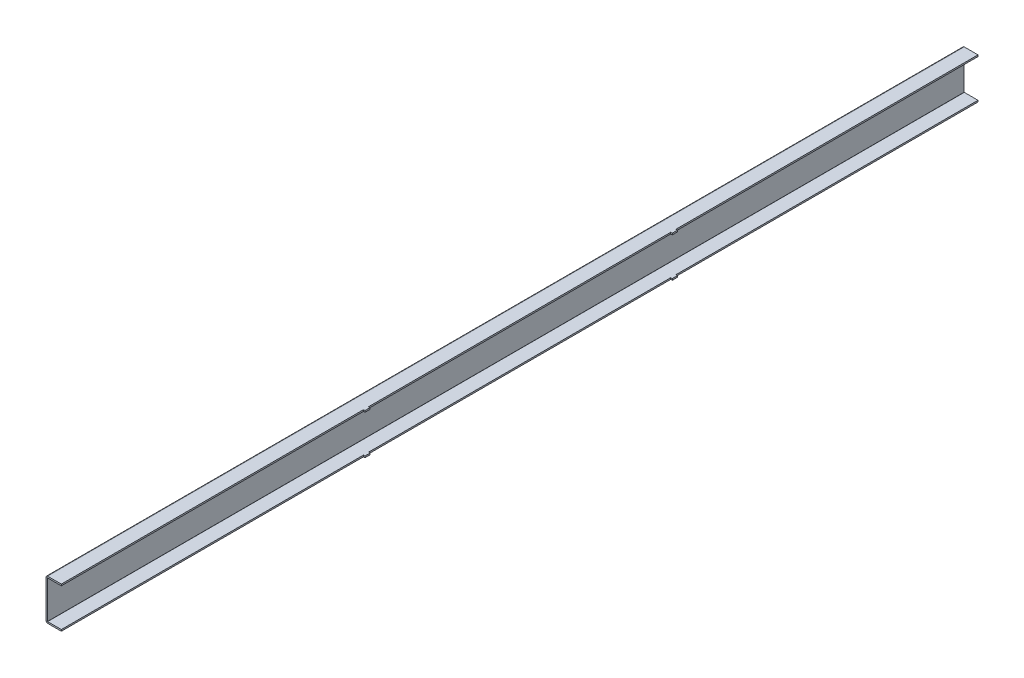
ISO-10303-21;
HEADER;
FILE_DESCRIPTION(('STEP AP214'),'2;1');
FILE_NAME('part.step','',(''),(''),'','','');
FILE_SCHEMA(('AUTOMOTIVE_DESIGN { 1 0 10303 214 1 1 1 1 }'));
ENDSEC;
DATA;
#1=APPLICATION_CONTEXT('core data for automotive mechanical design processes');
#2=APPLICATION_PROTOCOL_DEFINITION('international standard','automotive_design',2000,#1);
#3=PRODUCT_CONTEXT('',#1,'mechanical');
#4=PRODUCT('Part','Part','',(#3));
#5=PRODUCT_RELATED_PRODUCT_CATEGORY('part','',(#4));
#6=PRODUCT_DEFINITION_FORMATION('','',#4);
#7=PRODUCT_DEFINITION_CONTEXT('part definition',#1,'design');
#8=PRODUCT_DEFINITION('design','',#6,#7);
#9=PRODUCT_DEFINITION_SHAPE('','',#8);
#10=(LENGTH_UNIT() NAMED_UNIT(*) SI_UNIT(.MILLI.,.METRE.));
#11=(NAMED_UNIT(*) PLANE_ANGLE_UNIT() SI_UNIT($,.RADIAN.));
#12=(NAMED_UNIT(*) SI_UNIT($,.STERADIAN.) SOLID_ANGLE_UNIT());
#13=UNCERTAINTY_MEASURE_WITH_UNIT(LENGTH_MEASURE(1.E-05),#10,'distance_accuracy_value','');
#14=(GEOMETRIC_REPRESENTATION_CONTEXT(3) GLOBAL_UNCERTAINTY_ASSIGNED_CONTEXT((#13)) GLOBAL_UNIT_ASSIGNED_CONTEXT((#10,
#11,#12)) REPRESENTATION_CONTEXT('',''));
#15=CARTESIAN_POINT('',(0.,0.,0.));
#16=DIRECTION('',(0.,0.,1.));
#17=DIRECTION('',(1.,0.,0.));
#18=AXIS2_PLACEMENT_3D('',#15,#16,#17);
#19=CARTESIAN_POINT('',(197.5,1764.24748571651,602.833333333334));
#20=DIRECTION('',(0.,0.,1.));
#21=DIRECTION('',(0.,1.,0.));
#22=AXIS2_PLACEMENT_3D('',#19,#20,#21);
#23=PLANE('',#22);
#24=DIRECTION('',(-1.,0.,0.));
#25=VECTOR('',#24,1.);
#26=CARTESIAN_POINT('',(197.5,-30.,602.833333333334));
#27=LINE('',#26,#25);
#28=CARTESIAN_POINT('',(199.,-30.,602.833333333334));
#29=VERTEX_POINT('',#28);
#30=CARTESIAN_POINT('',(197.5,-30.,602.833333333334));
#31=VERTEX_POINT('',#30);
#32=EDGE_CURVE('E157',#29,#31,#27,.T.);
#33=ORIENTED_EDGE('',*,*,#32,.F.);
#34=DIRECTION('',(0.,-1.,0.));
#35=VECTOR('',#34,1.);
#36=CARTESIAN_POINT('',(199.,1764.24748571651,602.833333333334));
#37=LINE('',#36,#35);
#38=CARTESIAN_POINT('',(199.,-28.5,602.833333333334));
#39=VERTEX_POINT('',#38);
#40=EDGE_CURVE('E700',#39,#29,#37,.T.);
#41=ORIENTED_EDGE('',*,*,#40,.F.);
#42=DIRECTION('',(-1.,0.,0.));
#43=VECTOR('',#42,1.);
#44=CARTESIAN_POINT('',(197.5,-28.5,602.833333333334));
#45=LINE('',#44,#43);
#46=CARTESIAN_POINT('',(197.5,-28.5,602.833333333334));
#47=VERTEX_POINT('',#46);
#48=EDGE_CURVE('E151',#39,#47,#45,.T.);
#49=ORIENTED_EDGE('',*,*,#48,.T.);
#50=DIRECTION('',(0.,-1.,0.));
#51=VECTOR('',#50,1.);
#52=CARTESIAN_POINT('',(197.5,1764.24748571651,602.833333333334));
#53=LINE('',#52,#51);
#54=EDGE_CURVE('E706',#47,#31,#53,.T.);
#55=ORIENTED_EDGE('',*,*,#54,.T.);
#56=EDGE_LOOP('',(#33,#41,#49,#55));
#57=FACE_BOUND('',#56,.T.);
#58=ADVANCED_FACE('F55',(#57),#23,.T.);
#59=CARTESIAN_POINT('',(199.,1764.24748571651,597.833333333334));
#60=DIRECTION('',(1.,0.,0.));
#61=DIRECTION('',(0.,1.,0.));
#62=AXIS2_PLACEMENT_3D('',#59,#60,#61);
#63=PLANE('',#62);
#64=DIRECTION('',(0.,0.,1.));
#65=VECTOR('',#64,1.);
#66=CARTESIAN_POINT('',(199.,-30.,597.833333333334));
#67=LINE('',#66,#65);
#68=CARTESIAN_POINT('',(199.,-30.,597.833333333334));
#69=VERTEX_POINT('',#68);
#70=EDGE_CURVE('E397',#69,#29,#67,.T.);
#71=ORIENTED_EDGE('',*,*,#70,.F.);
#72=DIRECTION('',(0.,-1.,0.));
#73=VECTOR('',#72,1.);
#74=CARTESIAN_POINT('',(199.,1764.24748571651,597.833333333334));
#75=LINE('',#74,#73);
#76=CARTESIAN_POINT('',(199.,-28.5,597.833333333334));
#77=VERTEX_POINT('',#76);
#78=EDGE_CURVE('E692',#77,#69,#75,.T.);
#79=ORIENTED_EDGE('',*,*,#78,.F.);
#80=DIRECTION('',(0.,0.,1.));
#81=VECTOR('',#80,1.);
#82=CARTESIAN_POINT('',(199.,-28.5,597.833333333334));
#83=LINE('',#82,#81);
#84=EDGE_CURVE('E702',#77,#39,#83,.T.);
#85=ORIENTED_EDGE('',*,*,#84,.T.);
#86=ORIENTED_EDGE('',*,*,#40,.T.);
#87=EDGE_LOOP('',(#71,#79,#85,#86));
#88=FACE_BOUND('',#87,.T.);
#89=ADVANCED_FACE('F817',(#88),#63,.T.);
#90=CARTESIAN_POINT('',(197.5,1764.24748571651,597.833333333334));
#91=DIRECTION('',(0.,0.,-1.));
#92=DIRECTION('',(0.,-1.,0.));
#93=AXIS2_PLACEMENT_3D('',#90,#91,#92);
#94=PLANE('',#93);
#95=DIRECTION('',(1.,0.,0.));
#96=VECTOR('',#95,1.);
#97=CARTESIAN_POINT('',(197.5,-30.,597.833333333334));
#98=LINE('',#97,#96);
#99=CARTESIAN_POINT('',(197.5,-30.,597.833333333333));
#100=VERTEX_POINT('',#99);
#101=EDGE_CURVE('E389',#100,#69,#98,.T.);
#102=ORIENTED_EDGE('',*,*,#101,.F.);
#103=DIRECTION('',(0.,-1.,0.));
#104=VECTOR('',#103,1.);
#105=CARTESIAN_POINT('',(197.5,1764.24748571651,597.833333333333));
#106=LINE('',#105,#104);
#107=CARTESIAN_POINT('',(197.5,-28.5,597.833333333333));
#108=VERTEX_POINT('',#107);
#109=EDGE_CURVE('E652',#108,#100,#106,.T.);
#110=ORIENTED_EDGE('',*,*,#109,.F.);
#111=DIRECTION('',(1.,0.,0.));
#112=VECTOR('',#111,1.);
#113=CARTESIAN_POINT('',(197.5,-28.5,597.833333333334));
#114=LINE('',#113,#112);
#115=EDGE_CURVE('E696',#108,#77,#114,.T.);
#116=ORIENTED_EDGE('',*,*,#115,.T.);
#117=ORIENTED_EDGE('',*,*,#78,.T.);
#118=EDGE_LOOP('',(#102,#110,#116,#117));
#119=FACE_BOUND('',#118,.T.);
#120=ADVANCED_FACE('F822',(#119),#94,.T.);
#121=CARTESIAN_POINT('',(197.5,1764.24748571651,941.220018726588));
#122=DIRECTION('',(1.,0.,0.));
#123=DIRECTION('',(0.,1.,0.));
#124=AXIS2_PLACEMENT_3D('',#121,#122,#123);
#125=PLANE('',#124);
#126=DIRECTION('',(0.,0.,1.));
#127=VECTOR('',#126,1.);
#128=CARTESIAN_POINT('',(197.5,-30.,900.));
#129=LINE('',#128,#127);
#130=CARTESIAN_POINT('',(197.5,-30.,302.166666666667));
#131=VERTEX_POINT('',#130);
#132=EDGE_CURVE('E653',#100,#131,#129,.F.);
#133=ORIENTED_EDGE('',*,*,#132,.T.);
#134=DIRECTION('',(0.,-1.,0.));
#135=VECTOR('',#134,1.);
#136=CARTESIAN_POINT('',(197.5,1764.24748571651,302.166666666667));
#137=LINE('',#136,#135);
#138=CARTESIAN_POINT('',(197.5,-28.5,302.166666666667));
#139=VERTEX_POINT('',#138);
#140=EDGE_CURVE('E681',#139,#131,#137,.T.);
#141=ORIENTED_EDGE('',*,*,#140,.F.);
#142=DIRECTION('',(0.,0.,-1.));
#143=VECTOR('',#142,1.);
#144=CARTESIAN_POINT('',(197.5,-28.5,941.220018726588));
#145=LINE('',#144,#143);
#146=EDGE_CURVE('E642',#139,#108,#145,.F.);
#147=ORIENTED_EDGE('',*,*,#146,.T.);
#148=ORIENTED_EDGE('',*,*,#109,.T.);
#149=EDGE_LOOP('',(#133,#141,#147,#148));
#150=FACE_BOUND('',#149,.T.);
#151=ADVANCED_FACE('F831',(#150),#125,.T.);
#152=CARTESIAN_POINT('',(197.5,1764.24748571651,302.166666666667));
#153=DIRECTION('',(0.,0.,1.));
#154=DIRECTION('',(0.,1.,0.));
#155=AXIS2_PLACEMENT_3D('',#152,#153,#154);
#156=PLANE('',#155);
#157=DIRECTION('',(-1.,0.,0.));
#158=VECTOR('',#157,1.);
#159=CARTESIAN_POINT('',(197.5,-30.,302.166666666667));
#160=LINE('',#159,#158);
#161=CARTESIAN_POINT('',(199.,-30.,302.166666666667));
#162=VERTEX_POINT('',#161);
#163=EDGE_CURVE('E384',#162,#131,#160,.T.);
#164=ORIENTED_EDGE('',*,*,#163,.F.);
#165=DIRECTION('',(0.,-1.,0.));
#166=VECTOR('',#165,1.);
#167=CARTESIAN_POINT('',(199.,1764.24748571651,302.166666666667));
#168=LINE('',#167,#166);
#169=CARTESIAN_POINT('',(199.,-28.5,302.166666666667));
#170=VERTEX_POINT('',#169);
#171=EDGE_CURVE('E671',#170,#162,#168,.T.);
#172=ORIENTED_EDGE('',*,*,#171,.F.);
#173=DIRECTION('',(-1.,0.,0.));
#174=VECTOR('',#173,1.);
#175=CARTESIAN_POINT('',(197.5,-28.5,302.166666666667));
#176=LINE('',#175,#174);
#177=EDGE_CURVE('E684',#170,#139,#176,.T.);
#178=ORIENTED_EDGE('',*,*,#177,.T.);
#179=ORIENTED_EDGE('',*,*,#140,.T.);
#180=EDGE_LOOP('',(#164,#172,#178,#179));
#181=FACE_BOUND('',#180,.T.);
#182=ADVANCED_FACE('F838',(#181),#156,.T.);
#183=CARTESIAN_POINT('',(199.,1764.24748571651,297.166666666667));
#184=DIRECTION('',(1.,0.,0.));
#185=DIRECTION('',(0.,1.,0.));
#186=AXIS2_PLACEMENT_3D('',#183,#184,#185);
#187=PLANE('',#186);
#188=DIRECTION('',(0.,0.,1.));
#189=VECTOR('',#188,1.);
#190=CARTESIAN_POINT('',(199.,-30.,297.166666666667));
#191=LINE('',#190,#189);
#192=CARTESIAN_POINT('',(199.,-30.,297.166666666667));
#193=VERTEX_POINT('',#192);
#194=EDGE_CURVE('E379',#193,#162,#191,.T.);
#195=ORIENTED_EDGE('',*,*,#194,.F.);
#196=DIRECTION('',(0.,-1.,0.));
#197=VECTOR('',#196,1.);
#198=CARTESIAN_POINT('',(199.,1764.24748571651,297.166666666667));
#199=LINE('',#198,#197);
#200=CARTESIAN_POINT('',(199.,-28.5,297.166666666667));
#201=VERTEX_POINT('',#200);
#202=EDGE_CURVE('E647',#201,#193,#199,.T.);
#203=ORIENTED_EDGE('',*,*,#202,.F.);
#204=DIRECTION('',(0.,0.,1.));
#205=VECTOR('',#204,1.);
#206=CARTESIAN_POINT('',(199.,-28.5,297.166666666667));
#207=LINE('',#206,#205);
#208=EDGE_CURVE('E677',#201,#170,#207,.T.);
#209=ORIENTED_EDGE('',*,*,#208,.T.);
#210=ORIENTED_EDGE('',*,*,#171,.T.);
#211=EDGE_LOOP('',(#195,#203,#209,#210));
#212=FACE_BOUND('',#211,.T.);
#213=ADVANCED_FACE('F841',(#212),#187,.T.);
#214=CARTESIAN_POINT('',(197.5,1764.24748571651,297.166666666667));
#215=DIRECTION('',(0.,0.,-1.));
#216=DIRECTION('',(0.,-1.,0.));
#217=AXIS2_PLACEMENT_3D('',#214,#215,#216);
#218=PLANE('',#217);
#219=DIRECTION('',(1.,0.,0.));
#220=VECTOR('',#219,1.);
#221=CARTESIAN_POINT('',(197.5,-30.,297.166666666667));
#222=LINE('',#221,#220);
#223=CARTESIAN_POINT('',(197.5,-30.,297.166666666667));
#224=VERTEX_POINT('',#223);
#225=EDGE_CURVE('E329',#224,#193,#222,.T.);
#226=ORIENTED_EDGE('',*,*,#225,.F.);
#227=DIRECTION('',(0.,-1.,0.));
#228=VECTOR('',#227,1.);
#229=CARTESIAN_POINT('',(197.5,1764.24748571651,297.166666666667));
#230=LINE('',#229,#228);
#231=CARTESIAN_POINT('',(197.5,-28.5,297.166666666667));
#232=VERTEX_POINT('',#231);
#233=EDGE_CURVE('E639',#232,#224,#230,.T.);
#234=ORIENTED_EDGE('',*,*,#233,.F.);
#235=DIRECTION('',(1.,0.,0.));
#236=VECTOR('',#235,1.);
#237=CARTESIAN_POINT('',(197.5,-28.5,297.166666666667));
#238=LINE('',#237,#236);
#239=EDGE_CURVE('E634',#232,#201,#238,.T.);
#240=ORIENTED_EDGE('',*,*,#239,.T.);
#241=ORIENTED_EDGE('',*,*,#202,.T.);
#242=EDGE_LOOP('',(#226,#234,#240,#241));
#243=FACE_BOUND('',#242,.T.);
#244=ADVANCED_FACE('F837',(#243),#218,.T.);
#245=CARTESIAN_POINT('',(197.5,-30.,1.49999999999995));
#246=VERTEX_POINT('',#245);
#247=EDGE_CURVE('E640',#224,#246,#129,.F.);
#248=ORIENTED_EDGE('',*,*,#247,.T.);
#249=DIRECTION('',(0.,-1.,0.));
#250=VECTOR('',#249,1.);
#251=CARTESIAN_POINT('',(197.5,1764.24748571651,1.49999999999996));
#252=LINE('',#251,#250);
#253=CARTESIAN_POINT('',(197.5,-28.5,1.49999999999996));
#254=VERTEX_POINT('',#253);
#255=EDGE_CURVE('E79',#254,#246,#252,.T.);
#256=ORIENTED_EDGE('',*,*,#255,.F.);
#257=EDGE_CURVE('E632',#254,#232,#145,.F.);
#258=ORIENTED_EDGE('',*,*,#257,.T.);
#259=ORIENTED_EDGE('',*,*,#233,.T.);
#260=EDGE_LOOP('',(#248,#256,#258,#259));
#261=FACE_BOUND('',#260,.T.);
#262=ADVANCED_FACE('F833',(#261),#125,.T.);
#263=CARTESIAN_POINT('',(197.5,-30.,898.5));
#264=VERTEX_POINT('',#263);
#265=EDGE_CURVE('E356',#264,#31,#129,.F.);
#266=ORIENTED_EDGE('',*,*,#265,.T.);
#267=ORIENTED_EDGE('',*,*,#54,.F.);
#268=CARTESIAN_POINT('',(197.5,-28.5,898.5));
#269=VERTEX_POINT('',#268);
#270=EDGE_CURVE('E643',#47,#269,#145,.F.);
#271=ORIENTED_EDGE('',*,*,#270,.T.);
#272=DIRECTION('',(0.,-1.,0.));
#273=VECTOR('',#272,1.);
#274=CARTESIAN_POINT('',(197.5,1764.24748571651,898.5));
#275=LINE('',#274,#273);
#276=EDGE_CURVE('E351',#269,#264,#275,.T.);
#277=ORIENTED_EDGE('',*,*,#276,.T.);
#278=EDGE_LOOP('',(#266,#267,#271,#277));
#279=FACE_BOUND('',#278,.T.);
#280=ADVANCED_FACE('F836',(#279),#125,.T.);
#281=CARTESIAN_POINT('',(0.,1764.24748571651,898.5));
#282=DIRECTION('',(0.,0.,-1.));
#283=DIRECTION('',(0.,-1.,0.));
#284=AXIS2_PLACEMENT_3D('',#281,#282,#283);
#285=PLANE('',#284);
#286=DIRECTION('',(0.,-1.,0.));
#287=VECTOR('',#286,1.);
#288=CARTESIAN_POINT('',(184.1,1764.24748571651,898.5));
#289=LINE('',#288,#287);
#290=CARTESIAN_POINT('',(184.1,-28.5,898.5));
#291=VERTEX_POINT('',#290);
#292=CARTESIAN_POINT('',(184.1,-30.,898.5));
#293=VERTEX_POINT('',#292);
#294=EDGE_CURVE('E337',#291,#293,#289,.T.);
#295=ORIENTED_EDGE('',*,*,#294,.T.);
#296=DIRECTION('',(1.,0.,0.));
#297=VECTOR('',#296,1.);
#298=CARTESIAN_POINT('',(182.5,-30.,898.5));
#299=LINE('',#298,#297);
#300=EDGE_CURVE('E330',#293,#264,#299,.T.);
#301=ORIENTED_EDGE('',*,*,#300,.T.);
#302=ORIENTED_EDGE('',*,*,#276,.F.);
#303=DIRECTION('',(1.,0.,0.));
#304=VECTOR('',#303,1.);
#305=CARTESIAN_POINT('',(0.,-28.5,898.5));
#306=LINE('',#305,#304);
#307=EDGE_CURVE('E12',#291,#269,#306,.T.);
#308=ORIENTED_EDGE('',*,*,#307,.F.);
#309=EDGE_LOOP('',(#295,#301,#302,#308));
#310=FACE_BOUND('',#309,.T.);
#311=ADVANCED_FACE('F346',(#310),#285,.F.);
#312=CARTESIAN_POINT('',(182.5,-30.,941.220018726588));
#313=DIRECTION('',(0.,1.,0.));
#314=DIRECTION('',(0.,0.,1.));
#315=AXIS2_PLACEMENT_3D('',#312,#313,#314);
#316=PLANE('',#315);
#317=ORIENTED_EDGE('',*,*,#300,.F.);
#318=DIRECTION('',(0.,0.,-1.));
#319=VECTOR('',#318,1.);
#320=CARTESIAN_POINT('',(184.1,-30.,898.5));
#321=LINE('',#320,#319);
#322=CARTESIAN_POINT('',(184.1,-30.,1.5));
#323=VERTEX_POINT('',#322);
#324=EDGE_CURVE('E317',#293,#323,#321,.T.);
#325=ORIENTED_EDGE('',*,*,#324,.T.);
#326=DIRECTION('',(1.,0.,0.));
#327=VECTOR('',#326,1.);
#328=CARTESIAN_POINT('',(182.5,-30.,1.49999999999995));
#329=LINE('',#328,#327);
#330=EDGE_CURVE('E404',#246,#323,#329,.F.);
#331=ORIENTED_EDGE('',*,*,#330,.F.);
#332=ORIENTED_EDGE('',*,*,#247,.F.);
#333=ORIENTED_EDGE('',*,*,#225,.T.);
#334=ORIENTED_EDGE('',*,*,#194,.T.);
#335=ORIENTED_EDGE('',*,*,#163,.T.);
#336=ORIENTED_EDGE('',*,*,#132,.F.);
#337=ORIENTED_EDGE('',*,*,#101,.T.);
#338=ORIENTED_EDGE('',*,*,#70,.T.);
#339=ORIENTED_EDGE('',*,*,#32,.T.);
#340=ORIENTED_EDGE('',*,*,#265,.F.);
#341=EDGE_LOOP('',(#317,#325,#331,#332,#333,#334,#335,#336,#337,#338,#339,#340));
#342=FACE_BOUND('',#341,.T.);
#343=ADVANCED_FACE('F355',(#342),#316,.F.);
#344=CARTESIAN_POINT('',(0.,1764.24748571651,1.5));
#345=DIRECTION('',(0.,0.,-1.));
#346=DIRECTION('',(0.,-1.,0.));
#347=AXIS2_PLACEMENT_3D('',#344,#345,#346);
#348=PLANE('',#347);
#349=ORIENTED_EDGE('',*,*,#330,.T.);
#350=DIRECTION('',(0.,-1.,0.));
#351=VECTOR('',#350,1.);
#352=CARTESIAN_POINT('',(184.1,1764.24748571651,1.5));
#353=LINE('',#352,#351);
#354=CARTESIAN_POINT('',(184.1,-28.5,1.50000000000006));
#355=VERTEX_POINT('',#354);
#356=EDGE_CURVE('E60',#355,#323,#353,.T.);
#357=ORIENTED_EDGE('',*,*,#356,.F.);
#358=DIRECTION('',(-1.,0.,0.));
#359=VECTOR('',#358,1.);
#360=CARTESIAN_POINT('',(0.,-28.5,1.5));
#361=LINE('',#360,#359);
#362=EDGE_CURVE('E413',#254,#355,#361,.T.);
#363=ORIENTED_EDGE('',*,*,#362,.F.);
#364=ORIENTED_EDGE('',*,*,#255,.T.);
#365=EDGE_LOOP('',(#349,#357,#363,#364));
#366=FACE_BOUND('',#365,.T.);
#367=ADVANCED_FACE('F627',(#366),#348,.T.);
#368=CARTESIAN_POINT('',(184.,-28.5,941.220018726588));
#369=DIRECTION('',(0.,-1.,0.));
#370=DIRECTION('',(0.,0.,-1.));
#371=AXIS2_PLACEMENT_3D('',#368,#369,#370);
#372=PLANE('',#371);
#373=ORIENTED_EDGE('',*,*,#362,.T.);
#374=DIRECTION('',(0.,0.,1.));
#375=VECTOR('',#374,1.);
#376=CARTESIAN_POINT('',(184.1,-28.5,898.5));
#377=LINE('',#376,#375);
#378=EDGE_CURVE('E67',#355,#291,#377,.T.);
#379=ORIENTED_EDGE('',*,*,#378,.T.);
#380=ORIENTED_EDGE('',*,*,#307,.T.);
#381=ORIENTED_EDGE('',*,*,#270,.F.);
#382=ORIENTED_EDGE('',*,*,#48,.F.);
#383=ORIENTED_EDGE('',*,*,#84,.F.);
#384=ORIENTED_EDGE('',*,*,#115,.F.);
#385=ORIENTED_EDGE('',*,*,#146,.F.);
#386=ORIENTED_EDGE('',*,*,#177,.F.);
#387=ORIENTED_EDGE('',*,*,#208,.F.);
#388=ORIENTED_EDGE('',*,*,#239,.F.);
#389=ORIENTED_EDGE('',*,*,#257,.F.);
#390=EDGE_LOOP('',(#373,#379,#380,#381,#382,#383,#384,#385,#386,#387,#388,#389));
#391=FACE_BOUND('',#390,.T.);
#392=ADVANCED_FACE('F58',(#391),#372,.F.);
#393=CARTESIAN_POINT('',(197.5,-1784.24748571651,297.166666666667));
#394=DIRECTION('',(0.,0.,-1.));
#395=DIRECTION('',(0.,1.,0.));
#396=AXIS2_PLACEMENT_3D('',#393,#394,#395);
#397=PLANE('',#396);
#398=DIRECTION('',(-1.,0.,0.));
#399=VECTOR('',#398,1.);
#400=CARTESIAN_POINT('',(197.5,9.99999999999998,297.166666666667));
#401=LINE('',#400,#399);
#402=CARTESIAN_POINT('',(199.,9.99999999999998,297.166666666667));
#403=VERTEX_POINT('',#402);
#404=CARTESIAN_POINT('',(197.5,9.99999999999998,297.166666666667));
#405=VERTEX_POINT('',#404);
#406=EDGE_CURVE('E248',#403,#405,#401,.T.);
#407=ORIENTED_EDGE('',*,*,#406,.F.);
#408=DIRECTION('',(0.,1.,0.));
#409=VECTOR('',#408,1.);
#410=CARTESIAN_POINT('',(199.,-1784.24748571651,297.166666666667));
#411=LINE('',#410,#409);
#412=CARTESIAN_POINT('',(199.,8.49999999999992,297.166666666667));
#413=VERTEX_POINT('',#412);
#414=EDGE_CURVE('E450',#413,#403,#411,.T.);
#415=ORIENTED_EDGE('',*,*,#414,.F.);
#416=DIRECTION('',(-1.,0.,0.));
#417=VECTOR('',#416,1.);
#418=CARTESIAN_POINT('',(197.5,8.49999999999998,297.166666666667));
#419=LINE('',#418,#417);
#420=CARTESIAN_POINT('',(197.5,8.49999999999992,297.166666666667));
#421=VERTEX_POINT('',#420);
#422=EDGE_CURVE('E242',#413,#421,#419,.T.);
#423=ORIENTED_EDGE('',*,*,#422,.T.);
#424=DIRECTION('',(0.,1.,0.));
#425=VECTOR('',#424,1.);
#426=CARTESIAN_POINT('',(197.5,-1784.24748571651,297.166666666667));
#427=LINE('',#426,#425);
#428=EDGE_CURVE('E436',#421,#405,#427,.T.);
#429=ORIENTED_EDGE('',*,*,#428,.T.);
#430=EDGE_LOOP('',(#407,#415,#423,#429));
#431=FACE_BOUND('',#430,.T.);
#432=ADVANCED_FACE('F555',(#431),#397,.T.);
#433=CARTESIAN_POINT('',(199.,-1784.24748571651,302.166666666667));
#434=DIRECTION('',(1.,0.,0.));
#435=DIRECTION('',(0.,1.,0.));
#436=AXIS2_PLACEMENT_3D('',#433,#434,#435);
#437=PLANE('',#436);
#438=DIRECTION('',(0.,0.,-1.));
#439=VECTOR('',#438,1.);
#440=CARTESIAN_POINT('',(199.,9.99999999999998,302.166666666667));
#441=LINE('',#440,#439);
#442=CARTESIAN_POINT('',(199.,9.99999999999998,302.166666666667));
#443=VERTEX_POINT('',#442);
#444=EDGE_CURVE('E495',#443,#403,#441,.T.);
#445=ORIENTED_EDGE('',*,*,#444,.F.);
#446=DIRECTION('',(0.,1.,0.));
#447=VECTOR('',#446,1.);
#448=CARTESIAN_POINT('',(199.,-1784.24748571651,302.166666666667));
#449=LINE('',#448,#447);
#450=CARTESIAN_POINT('',(199.,8.49999999999992,302.166666666667));
#451=VERTEX_POINT('',#450);
#452=EDGE_CURVE('E456',#451,#443,#449,.T.);
#453=ORIENTED_EDGE('',*,*,#452,.F.);
#454=DIRECTION('',(0.,0.,-1.));
#455=VECTOR('',#454,1.);
#456=CARTESIAN_POINT('',(199.,8.49999999999998,302.166666666667));
#457=LINE('',#456,#455);
#458=EDGE_CURVE('E446',#451,#413,#457,.T.);
#459=ORIENTED_EDGE('',*,*,#458,.T.);
#460=ORIENTED_EDGE('',*,*,#414,.T.);
#461=EDGE_LOOP('',(#445,#453,#459,#460));
#462=FACE_BOUND('',#461,.T.);
#463=ADVANCED_FACE('F807',(#462),#437,.T.);
#464=CARTESIAN_POINT('',(197.5,-1784.24748571651,302.166666666667));
#465=DIRECTION('',(0.,0.,1.));
#466=DIRECTION('',(0.,-1.,0.));
#467=AXIS2_PLACEMENT_3D('',#464,#465,#466);
#468=PLANE('',#467);
#469=DIRECTION('',(1.,0.,0.));
#470=VECTOR('',#469,1.);
#471=CARTESIAN_POINT('',(197.5,9.99999999999998,302.166666666667));
#472=LINE('',#471,#470);
#473=CARTESIAN_POINT('',(197.5,9.99999999999998,302.166666666667));
#474=VERTEX_POINT('',#473);
#475=EDGE_CURVE('E491',#474,#443,#472,.T.);
#476=ORIENTED_EDGE('',*,*,#475,.F.);
#477=DIRECTION('',(0.,1.,0.));
#478=VECTOR('',#477,1.);
#479=CARTESIAN_POINT('',(197.5,-1784.24748571651,302.166666666667));
#480=LINE('',#479,#478);
#481=CARTESIAN_POINT('',(197.5,8.49999999999992,302.166666666667));
#482=VERTEX_POINT('',#481);
#483=EDGE_CURVE('E464',#482,#474,#480,.T.);
#484=ORIENTED_EDGE('',*,*,#483,.F.);
#485=DIRECTION('',(1.,0.,0.));
#486=VECTOR('',#485,1.);
#487=CARTESIAN_POINT('',(197.5,8.49999999999998,302.166666666667));
#488=LINE('',#487,#486);
#489=EDGE_CURVE('E452',#482,#451,#488,.T.);
#490=ORIENTED_EDGE('',*,*,#489,.T.);
#491=ORIENTED_EDGE('',*,*,#452,.T.);
#492=EDGE_LOOP('',(#476,#484,#490,#491));
#493=FACE_BOUND('',#492,.T.);
#494=ADVANCED_FACE('F803',(#493),#468,.T.);
#495=CARTESIAN_POINT('',(197.5,-1784.24748571651,941.220018726588));
#496=DIRECTION('',(1.,0.,0.));
#497=DIRECTION('',(0.,1.,0.));
#498=AXIS2_PLACEMENT_3D('',#495,#496,#497);
#499=PLANE('',#498);
#500=DIRECTION('',(0.,0.,1.));
#501=VECTOR('',#500,1.);
#502=CARTESIAN_POINT('',(197.5,9.99999999999998,900.));
#503=LINE('',#502,#501);
#504=CARTESIAN_POINT('',(197.5,9.99999999999998,597.833333333334));
#505=VERTEX_POINT('',#504);
#506=EDGE_CURVE('E460',#474,#505,#503,.T.);
#507=ORIENTED_EDGE('',*,*,#506,.T.);
#508=DIRECTION('',(0.,1.,0.));
#509=VECTOR('',#508,1.);
#510=CARTESIAN_POINT('',(197.5,-1784.24748571651,597.833333333334));
#511=LINE('',#510,#509);
#512=CARTESIAN_POINT('',(197.5,8.49999999999992,597.833333333334));
#513=VERTEX_POINT('',#512);
#514=EDGE_CURVE('E734',#513,#505,#511,.T.);
#515=ORIENTED_EDGE('',*,*,#514,.F.);
#516=DIRECTION('',(0.,0.,1.));
#517=VECTOR('',#516,1.);
#518=CARTESIAN_POINT('',(197.5,8.49999999999998,941.220018726588));
#519=LINE('',#518,#517);
#520=EDGE_CURVE('E463',#513,#482,#519,.F.);
#521=ORIENTED_EDGE('',*,*,#520,.T.);
#522=ORIENTED_EDGE('',*,*,#483,.T.);
#523=EDGE_LOOP('',(#507,#515,#521,#522));
#524=FACE_BOUND('',#523,.T.);
#525=ADVANCED_FACE('F799',(#524),#499,.T.);
#526=CARTESIAN_POINT('',(197.5,-1784.24748571651,597.833333333334));
#527=DIRECTION('',(0.,0.,-1.));
#528=DIRECTION('',(0.,1.,0.));
#529=AXIS2_PLACEMENT_3D('',#526,#527,#528);
#530=PLANE('',#529);
#531=DIRECTION('',(-1.,0.,0.));
#532=VECTOR('',#531,1.);
#533=CARTESIAN_POINT('',(197.5,9.99999999999998,597.833333333334));
#534=LINE('',#533,#532);
#535=CARTESIAN_POINT('',(199.,9.99999999999998,597.833333333334));
#536=VERTEX_POINT('',#535);
#537=EDGE_CURVE('E496',#536,#505,#534,.T.);
#538=ORIENTED_EDGE('',*,*,#537,.F.);
#539=DIRECTION('',(0.,1.,0.));
#540=VECTOR('',#539,1.);
#541=CARTESIAN_POINT('',(199.,-1784.24748571651,597.833333333334));
#542=LINE('',#541,#540);
#543=CARTESIAN_POINT('',(199.,8.49999999999992,597.833333333334));
#544=VERTEX_POINT('',#543);
#545=EDGE_CURVE('E724',#544,#536,#542,.T.);
#546=ORIENTED_EDGE('',*,*,#545,.F.);
#547=DIRECTION('',(-1.,0.,0.));
#548=VECTOR('',#547,1.);
#549=CARTESIAN_POINT('',(197.5,8.49999999999998,597.833333333334));
#550=LINE('',#549,#548);
#551=EDGE_CURVE('E738',#544,#513,#550,.T.);
#552=ORIENTED_EDGE('',*,*,#551,.T.);
#553=ORIENTED_EDGE('',*,*,#514,.T.);
#554=EDGE_LOOP('',(#538,#546,#552,#553));
#555=FACE_BOUND('',#554,.T.);
#556=ADVANCED_FACE('F795',(#555),#530,.T.);
#557=CARTESIAN_POINT('',(199.,-1784.24748571651,602.833333333334));
#558=DIRECTION('',(1.,0.,0.));
#559=DIRECTION('',(0.,1.,0.));
#560=AXIS2_PLACEMENT_3D('',#557,#558,#559);
#561=PLANE('',#560);
#562=DIRECTION('',(0.,0.,-1.));
#563=VECTOR('',#562,1.);
#564=CARTESIAN_POINT('',(199.,9.99999999999998,602.833333333334));
#565=LINE('',#564,#563);
#566=CARTESIAN_POINT('',(199.,9.99999999999998,602.833333333334));
#567=VERTEX_POINT('',#566);
#568=EDGE_CURVE('E503',#567,#536,#565,.T.);
#569=ORIENTED_EDGE('',*,*,#568,.F.);
#570=DIRECTION('',(0.,1.,0.));
#571=VECTOR('',#570,1.);
#572=CARTESIAN_POINT('',(199.,-1784.24748571651,602.833333333334));
#573=LINE('',#572,#571);
#574=CARTESIAN_POINT('',(199.,8.49999999999992,602.833333333334));
#575=VERTEX_POINT('',#574);
#576=EDGE_CURVE('E544',#575,#567,#573,.T.);
#577=ORIENTED_EDGE('',*,*,#576,.F.);
#578=DIRECTION('',(0.,0.,-1.));
#579=VECTOR('',#578,1.);
#580=CARTESIAN_POINT('',(199.,8.49999999999998,602.833333333334));
#581=LINE('',#580,#579);
#582=EDGE_CURVE('E728',#575,#544,#581,.T.);
#583=ORIENTED_EDGE('',*,*,#582,.T.);
#584=ORIENTED_EDGE('',*,*,#545,.T.);
#585=EDGE_LOOP('',(#569,#577,#583,#584));
#586=FACE_BOUND('',#585,.T.);
#587=ADVANCED_FACE('F793',(#586),#561,.T.);
#588=CARTESIAN_POINT('',(197.5,-1784.24748571651,602.833333333334));
#589=DIRECTION('',(0.,0.,1.));
#590=DIRECTION('',(0.,-1.,0.));
#591=AXIS2_PLACEMENT_3D('',#588,#589,#590);
#592=PLANE('',#591);
#593=DIRECTION('',(1.,0.,0.));
#594=VECTOR('',#593,1.);
#595=CARTESIAN_POINT('',(197.5,9.99999999999998,602.833333333334));
#596=LINE('',#595,#594);
#597=CARTESIAN_POINT('',(197.5,9.99999999999998,602.833333333334));
#598=VERTEX_POINT('',#597);
#599=EDGE_CURVE('E508',#598,#567,#596,.T.);
#600=ORIENTED_EDGE('',*,*,#599,.F.);
#601=DIRECTION('',(0.,1.,0.));
#602=VECTOR('',#601,1.);
#603=CARTESIAN_POINT('',(197.5,-1784.24748571651,602.833333333334));
#604=LINE('',#603,#602);
#605=CARTESIAN_POINT('',(197.5,8.49999999999992,602.833333333334));
#606=VERTEX_POINT('',#605);
#607=EDGE_CURVE('E471',#606,#598,#604,.T.);
#608=ORIENTED_EDGE('',*,*,#607,.F.);
#609=DIRECTION('',(1.,0.,0.));
#610=VECTOR('',#609,1.);
#611=CARTESIAN_POINT('',(197.5,8.49999999999998,602.833333333334));
#612=LINE('',#611,#610);
#613=EDGE_CURVE('E727',#606,#575,#612,.T.);
#614=ORIENTED_EDGE('',*,*,#613,.T.);
#615=ORIENTED_EDGE('',*,*,#576,.T.);
#616=EDGE_LOOP('',(#600,#608,#614,#615));
#617=FACE_BOUND('',#616,.T.);
#618=ADVANCED_FACE('F781',(#617),#592,.T.);
#619=CARTESIAN_POINT('',(197.5,9.99999999999998,898.5));
#620=VERTEX_POINT('',#619);
#621=EDGE_CURVE('E475',#598,#620,#503,.T.);
#622=ORIENTED_EDGE('',*,*,#621,.T.);
#623=DIRECTION('',(0.,1.,0.));
#624=VECTOR('',#623,1.);
#625=CARTESIAN_POINT('',(197.5,-1784.24748571651,898.5));
#626=LINE('',#625,#624);
#627=CARTESIAN_POINT('',(197.5,8.49999999999992,898.5));
#628=VERTEX_POINT('',#627);
#629=EDGE_CURVE('E170',#628,#620,#626,.T.);
#630=ORIENTED_EDGE('',*,*,#629,.F.);
#631=EDGE_CURVE('E536',#628,#606,#519,.F.);
#632=ORIENTED_EDGE('',*,*,#631,.T.);
#633=ORIENTED_EDGE('',*,*,#607,.T.);
#634=EDGE_LOOP('',(#622,#630,#632,#633));
#635=FACE_BOUND('',#634,.T.);
#636=ADVANCED_FACE('F787',(#635),#499,.T.);
#637=CARTESIAN_POINT('',(197.5,9.99999999999998,1.49999999999996));
#638=VERTEX_POINT('',#637);
#639=EDGE_CURVE('E469',#638,#405,#503,.T.);
#640=ORIENTED_EDGE('',*,*,#639,.T.);
#641=ORIENTED_EDGE('',*,*,#428,.F.);
#642=CARTESIAN_POINT('',(197.5,8.49999999999992,1.49999999999996));
#643=VERTEX_POINT('',#642);
#644=EDGE_CURVE('E534',#421,#643,#519,.F.);
#645=ORIENTED_EDGE('',*,*,#644,.T.);
#646=DIRECTION('',(0.,1.,0.));
#647=VECTOR('',#646,1.);
#648=CARTESIAN_POINT('',(197.5,-1784.24748571651,1.49999999999996));
#649=LINE('',#648,#647);
#650=EDGE_CURVE('E529',#643,#638,#649,.T.);
#651=ORIENTED_EDGE('',*,*,#650,.T.);
#652=EDGE_LOOP('',(#640,#641,#645,#651));
#653=FACE_BOUND('',#652,.T.);
#654=ADVANCED_FACE('F552',(#653),#499,.T.);
#655=CARTESIAN_POINT('',(2.22044604925031E-13,-1784.24748571651,1.5));
#656=DIRECTION('',(0.,0.,-1.));
#657=DIRECTION('',(0.,1.,0.));
#658=AXIS2_PLACEMENT_3D('',#655,#656,#657);
#659=PLANE('',#658);
#660=DIRECTION('',(1.,0.,0.));
#661=VECTOR('',#660,1.);
#662=CARTESIAN_POINT('',(0.,10.,1.5));
#663=LINE('',#662,#661);
#664=CARTESIAN_POINT('',(184.1,9.99999999999994,1.49999999999995));
#665=VERTEX_POINT('',#664);
#666=EDGE_CURVE('E527',#665,#638,#663,.T.);
#667=ORIENTED_EDGE('',*,*,#666,.T.);
#668=ORIENTED_EDGE('',*,*,#650,.F.);
#669=DIRECTION('',(1.,0.,0.));
#670=VECTOR('',#669,1.);
#671=CARTESIAN_POINT('',(0.,8.49999999999998,1.5));
#672=LINE('',#671,#670);
#673=CARTESIAN_POINT('',(184.1,8.49999999999997,1.49999999999995));
#674=VERTEX_POINT('',#673);
#675=EDGE_CURVE('E1290',#643,#674,#672,.F.);
#676=ORIENTED_EDGE('',*,*,#675,.T.);
#677=DIRECTION('',(0.,1.,0.));
#678=VECTOR('',#677,1.);
#679=CARTESIAN_POINT('',(184.1,-1784.24748571651,1.5));
#680=LINE('',#679,#678);
#681=EDGE_CURVE('E1288',#674,#665,#680,.T.);
#682=ORIENTED_EDGE('',*,*,#681,.T.);
#683=EDGE_LOOP('',(#667,#668,#676,#682));
#684=FACE_BOUND('',#683,.T.);
#685=ADVANCED_FACE('F925',(#684),#659,.T.);
#686=CARTESIAN_POINT('',(197.5,9.99999999999998,941.220018726588));
#687=DIRECTION('',(0.,-1.,0.));
#688=DIRECTION('',(1.,0.,0.));
#689=AXIS2_PLACEMENT_3D('',#686,#687,#688);
#690=PLANE('',#689);
#691=ORIENTED_EDGE('',*,*,#666,.F.);
#692=DIRECTION('',(0.,0.,1.));
#693=VECTOR('',#692,1.);
#694=CARTESIAN_POINT('',(184.1,9.99999999999998,1.49999999999996));
#695=LINE('',#694,#693);
#696=CARTESIAN_POINT('',(184.1,9.99999999999995,898.5));
#697=VERTEX_POINT('',#696);
#698=EDGE_CURVE('E517',#665,#697,#695,.T.);
#699=ORIENTED_EDGE('',*,*,#698,.T.);
#700=DIRECTION('',(1.,0.,0.));
#701=VECTOR('',#700,1.);
#702=CARTESIAN_POINT('',(197.500000000003,9.99999999999998,898.5));
#703=LINE('',#702,#701);
#704=EDGE_CURVE('E513',#697,#620,#703,.T.);
#705=ORIENTED_EDGE('',*,*,#704,.T.);
#706=ORIENTED_EDGE('',*,*,#621,.F.);
#707=ORIENTED_EDGE('',*,*,#599,.T.);
#708=ORIENTED_EDGE('',*,*,#568,.T.);
#709=ORIENTED_EDGE('',*,*,#537,.T.);
#710=ORIENTED_EDGE('',*,*,#506,.F.);
#711=ORIENTED_EDGE('',*,*,#475,.T.);
#712=ORIENTED_EDGE('',*,*,#444,.T.);
#713=ORIENTED_EDGE('',*,*,#406,.T.);
#714=ORIENTED_EDGE('',*,*,#639,.F.);
#715=EDGE_LOOP('',(#691,#699,#705,#706,#707,#708,#709,#710,#711,#712,#713,#714));
#716=FACE_BOUND('',#715,.T.);
#717=ADVANCED_FACE('F559',(#716),#690,.F.);
#718=CARTESIAN_POINT('',(197.5,-1784.24748571651,898.5));
#719=DIRECTION('',(0.,0.,1.));
#720=DIRECTION('',(0.,-1.,0.));
#721=AXIS2_PLACEMENT_3D('',#718,#719,#720);
#722=PLANE('',#721);
#723=ORIENTED_EDGE('',*,*,#704,.F.);
#724=DIRECTION('',(0.,1.,0.));
#725=VECTOR('',#724,1.);
#726=CARTESIAN_POINT('',(184.1,-1784.24748571651,898.5));
#727=LINE('',#726,#725);
#728=CARTESIAN_POINT('',(184.1,8.49999999999997,898.5));
#729=VERTEX_POINT('',#728);
#730=EDGE_CURVE('E428',#729,#697,#727,.T.);
#731=ORIENTED_EDGE('',*,*,#730,.F.);
#732=DIRECTION('',(-1.,0.,0.));
#733=VECTOR('',#732,1.);
#734=CARTESIAN_POINT('',(197.5,8.49999999999992,898.5));
#735=LINE('',#734,#733);
#736=EDGE_CURVE('E563',#628,#729,#735,.T.);
#737=ORIENTED_EDGE('',*,*,#736,.F.);
#738=ORIENTED_EDGE('',*,*,#629,.T.);
#739=EDGE_LOOP('',(#723,#731,#737,#738));
#740=FACE_BOUND('',#739,.T.);
#741=ADVANCED_FACE('F944',(#740),#722,.T.);
#742=CARTESIAN_POINT('',(197.5,8.49999999999998,941.220018726588));
#743=DIRECTION('',(0.,1.,0.));
#744=DIRECTION('',(-1.,0.,0.));
#745=AXIS2_PLACEMENT_3D('',#742,#743,#744);
#746=PLANE('',#745);
#747=ORIENTED_EDGE('',*,*,#736,.T.);
#748=DIRECTION('',(0.,0.,-1.));
#749=VECTOR('',#748,1.);
#750=CARTESIAN_POINT('',(184.1,8.49999999999992,1.49999999999996));
#751=LINE('',#750,#749);
#752=EDGE_CURVE('E571',#729,#674,#751,.T.);
#753=ORIENTED_EDGE('',*,*,#752,.T.);
#754=ORIENTED_EDGE('',*,*,#675,.F.);
#755=ORIENTED_EDGE('',*,*,#644,.F.);
#756=ORIENTED_EDGE('',*,*,#422,.F.);
#757=ORIENTED_EDGE('',*,*,#458,.F.);
#758=ORIENTED_EDGE('',*,*,#489,.F.);
#759=ORIENTED_EDGE('',*,*,#520,.F.);
#760=ORIENTED_EDGE('',*,*,#551,.F.);
#761=ORIENTED_EDGE('',*,*,#582,.F.);
#762=ORIENTED_EDGE('',*,*,#613,.F.);
#763=ORIENTED_EDGE('',*,*,#631,.F.);
#764=EDGE_LOOP('',(#747,#753,#754,#755,#756,#757,#758,#759,#760,#761,#762,#763));
#765=FACE_BOUND('',#764,.T.);
#766=ADVANCED_FACE('F789',(#765),#746,.F.);
#767=CARTESIAN_POINT('',(1978.00910886022,8.49999999999998,898.5));
#768=DIRECTION('',(0.,0.,1.));
#769=DIRECTION('',(1.,0.,0.));
#770=AXIS2_PLACEMENT_3D('',#767,#768,#769);
#771=PLANE('',#770);
#772=DIRECTION('',(0.,1.,0.));
#773=VECTOR('',#772,1.);
#774=CARTESIAN_POINT('',(182.5,0.,898.5));
#775=LINE('',#774,#773);
#776=CARTESIAN_POINT('',(182.5,-28.4,898.5));
#777=VERTEX_POINT('',#776);
#778=CARTESIAN_POINT('',(182.5,8.39999999999997,898.5));
#779=VERTEX_POINT('',#778);
#780=EDGE_CURVE('E260',#777,#779,#775,.T.);
#781=ORIENTED_EDGE('',*,*,#780,.F.);
#782=DIRECTION('',(-1.,0.,0.));
#783=VECTOR('',#782,1.);
#784=CARTESIAN_POINT('',(1978.00910886022,-28.4,898.5));
#785=LINE('',#784,#783);
#786=CARTESIAN_POINT('',(184.,-28.4,898.5));
#787=VERTEX_POINT('',#786);
#788=EDGE_CURVE('E340',#787,#777,#785,.T.);
#789=ORIENTED_EDGE('',*,*,#788,.F.);
#790=DIRECTION('',(0.,1.,0.));
#791=VECTOR('',#790,1.);
#792=CARTESIAN_POINT('',(184.,8.49999999999998,898.5));
#793=LINE('',#792,#791);
#794=CARTESIAN_POINT('',(184.,8.39999999999997,898.5));
#795=VERTEX_POINT('',#794);
#796=EDGE_CURVE('E758',#787,#795,#793,.T.);
#797=ORIENTED_EDGE('',*,*,#796,.T.);
#798=DIRECTION('',(-1.,0.,0.));
#799=VECTOR('',#798,1.);
#800=CARTESIAN_POINT('',(1978.00910886022,8.39999999999997,898.5));
#801=LINE('',#800,#799);
#802=EDGE_CURVE('E751',#795,#779,#801,.T.);
#803=ORIENTED_EDGE('',*,*,#802,.T.);
#804=EDGE_LOOP('',(#781,#789,#797,#803));
#805=FACE_BOUND('',#804,.T.);
#806=ADVANCED_FACE('F961',(#805),#771,.T.);
#807=CARTESIAN_POINT('',(1978.00910886022,8.49999999999998,1.49999999999995));
#808=DIRECTION('',(0.,0.,-1.));
#809=DIRECTION('',(-1.,0.,0.));
#810=AXIS2_PLACEMENT_3D('',#807,#808,#809);
#811=PLANE('',#810);
#812=DIRECTION('',(0.,1.,0.));
#813=VECTOR('',#812,1.);
#814=CARTESIAN_POINT('',(182.5,0.,1.5));
#815=LINE('',#814,#813);
#816=CARTESIAN_POINT('',(182.5,-28.4,1.5));
#817=VERTEX_POINT('',#816);
#818=CARTESIAN_POINT('',(182.5,8.39999999999997,1.5));
#819=VERTEX_POINT('',#818);
#820=EDGE_CURVE('E716',#817,#819,#815,.T.);
#821=ORIENTED_EDGE('',*,*,#820,.T.);
#822=DIRECTION('',(-1.,0.,0.));
#823=VECTOR('',#822,1.);
#824=CARTESIAN_POINT('',(1978.00910886022,8.39999999999997,1.49999999999995));
#825=LINE('',#824,#823);
#826=CARTESIAN_POINT('',(184.,8.39999999999997,1.49999999999995));
#827=VERTEX_POINT('',#826);
#828=EDGE_CURVE('E747',#827,#819,#825,.T.);
#829=ORIENTED_EDGE('',*,*,#828,.F.);
#830=DIRECTION('',(0.,1.,0.));
#831=VECTOR('',#830,1.);
#832=CARTESIAN_POINT('',(184.,8.49999999999998,1.49999999999995));
#833=LINE('',#832,#831);
#834=CARTESIAN_POINT('',(184.,-28.4,1.49999999999995));
#835=VERTEX_POINT('',#834);
#836=EDGE_CURVE('E756',#827,#835,#833,.F.);
#837=ORIENTED_EDGE('',*,*,#836,.T.);
#838=DIRECTION('',(-1.,0.,0.));
#839=VECTOR('',#838,1.);
#840=CARTESIAN_POINT('',(1978.00910886022,-28.4,1.49999999999995));
#841=LINE('',#840,#839);
#842=EDGE_CURVE('E625',#835,#817,#841,.T.);
#843=ORIENTED_EDGE('',*,*,#842,.T.);
#844=EDGE_LOOP('',(#821,#829,#837,#843));
#845=FACE_BOUND('',#844,.T.);
#846=ADVANCED_FACE('F970',(#845),#811,.T.);
#847=CARTESIAN_POINT('',(184.,8.49999999999998,941.220018726588));
#848=DIRECTION('',(-1.,0.,0.));
#849=DIRECTION('',(0.,0.,1.));
#850=AXIS2_PLACEMENT_3D('',#847,#848,#849);
#851=PLANE('',#850);
#852=DIRECTION('',(0.,0.,1.));
#853=VECTOR('',#852,1.);
#854=CARTESIAN_POINT('',(184.,-28.4,898.5));
#855=LINE('',#854,#853);
#856=EDGE_CURVE('E270',#835,#787,#855,.T.);
#857=ORIENTED_EDGE('',*,*,#856,.F.);
#858=ORIENTED_EDGE('',*,*,#836,.F.);
#859=DIRECTION('',(0.,0.,-1.));
#860=VECTOR('',#859,1.);
#861=CARTESIAN_POINT('',(184.,8.39999999999997,1.49999999999996));
#862=LINE('',#861,#860);
#863=EDGE_CURVE('E580',#795,#827,#862,.T.);
#864=ORIENTED_EDGE('',*,*,#863,.F.);
#865=ORIENTED_EDGE('',*,*,#796,.F.);
#866=EDGE_LOOP('',(#857,#858,#864,#865));
#867=FACE_BOUND('',#866,.T.);
#868=ADVANCED_FACE('F980',(#867),#851,.F.);
#869=CARTESIAN_POINT('',(182.5,9.99999999999997,941.220018726588));
#870=DIRECTION('',(1.,0.,0.));
#871=DIRECTION('',(0.,0.,-1.));
#872=AXIS2_PLACEMENT_3D('',#869,#870,#871);
#873=PLANE('',#872);
#874=DIRECTION('',(0.,0.,-1.));
#875=VECTOR('',#874,1.);
#876=CARTESIAN_POINT('',(182.5,-28.4,898.5));
#877=LINE('',#876,#875);
#878=EDGE_CURVE('E720',#777,#817,#877,.T.);
#879=ORIENTED_EDGE('',*,*,#878,.F.);
#880=ORIENTED_EDGE('',*,*,#780,.T.);
#881=DIRECTION('',(0.,0.,1.));
#882=VECTOR('',#881,1.);
#883=CARTESIAN_POINT('',(182.5,8.39999999999997,1.49999999999996));
#884=LINE('',#883,#882);
#885=EDGE_CURVE('E432',#819,#779,#884,.T.);
#886=ORIENTED_EDGE('',*,*,#885,.F.);
#887=ORIENTED_EDGE('',*,*,#820,.F.);
#888=EDGE_LOOP('',(#879,#880,#886,#887));
#889=FACE_BOUND('',#888,.T.);
#890=ADVANCED_FACE('F990',(#889),#873,.F.);
#891=CARTESIAN_POINT('',(184.1,8.39999999999997,1.49999999999995));
#892=DIRECTION('',(0.,1.08420217248565E-13,-1.));
#893=DIRECTION('',(0.,1.,1.08420217248565E-13));
#894=AXIS2_PLACEMENT_3D('',#891,#892,#893);
#895=PLANE('',#894);
#896=ORIENTED_EDGE('',*,*,#681,.F.);
#897=CARTESIAN_POINT('',(184.1,8.39999999999997,1.49999999999995));
#898=DIRECTION('',(0.,0.,1.));
#899=DIRECTION('',(0.,-1.,0.));
#900=AXIS2_PLACEMENT_3D('',#897,#898,#899);
#901=CIRCLE('',#900,0.0999999999999967);
#902=EDGE_CURVE('E603',#674,#827,#901,.T.);
#903=ORIENTED_EDGE('',*,*,#902,.T.);
#904=ORIENTED_EDGE('',*,*,#828,.T.);
#905=CARTESIAN_POINT('',(184.1,8.39999999999997,1.49999999999995));
#906=DIRECTION('',(0.,0.,1.));
#907=DIRECTION('',(0.,-1.,0.));
#908=AXIS2_PLACEMENT_3D('',#905,#906,#907);
#909=CIRCLE('',#908,1.59999999999997);
#910=EDGE_CURVE('E592',#665,#819,#909,.T.);
#911=ORIENTED_EDGE('',*,*,#910,.F.);
#912=EDGE_LOOP('',(#896,#903,#904,#911));
#913=FACE_BOUND('',#912,.T.);
#914=ADVANCED_FACE('F1000',(#913),#895,.T.);
#915=CARTESIAN_POINT('',(184.1,8.39999999999997,898.5));
#916=DIRECTION('',(0.,0.,1.));
#917=DIRECTION('',(1.,0.,0.));
#918=AXIS2_PLACEMENT_3D('',#915,#916,#917);
#919=PLANE('',#918);
#920=CARTESIAN_POINT('',(184.1,8.39999999999997,898.5));
#921=DIRECTION('',(0.,0.,1.));
#922=DIRECTION('',(0.,-1.,0.));
#923=AXIS2_PLACEMENT_3D('',#920,#921,#922);
#924=CIRCLE('',#923,0.0999999999999967);
#925=EDGE_CURVE('E599',#795,#729,#924,.F.);
#926=ORIENTED_EDGE('',*,*,#925,.T.);
#927=ORIENTED_EDGE('',*,*,#730,.T.);
#928=CARTESIAN_POINT('',(184.1,8.39999999999997,898.5));
#929=DIRECTION('',(0.,0.,1.));
#930=DIRECTION('',(0.,-1.,0.));
#931=AXIS2_PLACEMENT_3D('',#928,#929,#930);
#932=CIRCLE('',#931,1.59999999999997);
#933=EDGE_CURVE('E598',#779,#697,#932,.F.);
#934=ORIENTED_EDGE('',*,*,#933,.F.);
#935=ORIENTED_EDGE('',*,*,#802,.F.);
#936=EDGE_LOOP('',(#926,#927,#934,#935));
#937=FACE_BOUND('',#936,.T.);
#938=ADVANCED_FACE('F1009',(#937),#919,.T.);
#939=CARTESIAN_POINT('',(184.1,8.39999999999997,-898.045096271926));
#940=DIRECTION('',(0.,0.,1.));
#941=DIRECTION('',(0.,-1.,0.));
#942=AXIS2_PLACEMENT_3D('',#939,#940,#941);
#943=CYLINDRICAL_SURFACE('',#942,1.59999999999997);
#944=ORIENTED_EDGE('',*,*,#885,.T.);
#945=ORIENTED_EDGE('',*,*,#933,.T.);
#946=ORIENTED_EDGE('',*,*,#698,.F.);
#947=ORIENTED_EDGE('',*,*,#910,.T.);
#948=EDGE_LOOP('',(#944,#945,#946,#947));
#949=FACE_BOUND('',#948,.T.);
#950=ADVANCED_FACE('F1019',(#949),#943,.T.);
#951=CARTESIAN_POINT('',(184.1,8.39999999999997,-898.045096271926));
#952=DIRECTION('',(0.,0.,1.));
#953=DIRECTION('',(0.,-1.,0.));
#954=AXIS2_PLACEMENT_3D('',#951,#952,#953);
#955=CYLINDRICAL_SURFACE('',#954,0.0999999999999967);
#956=ORIENTED_EDGE('',*,*,#863,.T.);
#957=ORIENTED_EDGE('',*,*,#902,.F.);
#958=ORIENTED_EDGE('',*,*,#752,.F.);
#959=ORIENTED_EDGE('',*,*,#925,.F.);
#960=EDGE_LOOP('',(#956,#957,#958,#959));
#961=FACE_BOUND('',#960,.T.);
#962=ADVANCED_FACE('F1029',(#961),#955,.F.);
#963=CARTESIAN_POINT('',(184.1,-28.4,898.5));
#964=DIRECTION('',(0.,0.,1.));
#965=DIRECTION('',(1.,0.,0.));
#966=AXIS2_PLACEMENT_3D('',#963,#964,#965);
#967=PLANE('',#966);
#968=ORIENTED_EDGE('',*,*,#294,.F.);
#969=CARTESIAN_POINT('',(184.1,-28.4,898.5));
#970=DIRECTION('',(0.,0.,-1.));
#971=DIRECTION('',(-1.,0.,0.));
#972=AXIS2_PLACEMENT_3D('',#969,#970,#971);
#973=CIRCLE('',#972,0.0999999999999903);
#974=EDGE_CURVE('E611',#291,#787,#973,.T.);
#975=ORIENTED_EDGE('',*,*,#974,.T.);
#976=ORIENTED_EDGE('',*,*,#788,.T.);
#977=CARTESIAN_POINT('',(184.1,-28.4,898.5));
#978=DIRECTION('',(0.,0.,-1.));
#979=DIRECTION('',(-1.,0.,0.));
#980=AXIS2_PLACEMENT_3D('',#977,#978,#979);
#981=CIRCLE('',#980,1.59999999999997);
#982=EDGE_CURVE('E321',#293,#777,#981,.T.);
#983=ORIENTED_EDGE('',*,*,#982,.F.);
#984=EDGE_LOOP('',(#968,#975,#976,#983));
#985=FACE_BOUND('',#984,.T.);
#986=ADVANCED_FACE('F335',(#985),#967,.T.);
#987=CARTESIAN_POINT('',(184.1,-28.4,1.50000000000006));
#988=DIRECTION('',(0.,-1.08420217248584E-13,-1.));
#989=DIRECTION('',(0.,1.,-1.08420217248584E-13));
#990=AXIS2_PLACEMENT_3D('',#987,#988,#989);
#991=PLANE('',#990);
#992=CARTESIAN_POINT('',(184.1,-28.4,1.50000000000006));
#993=DIRECTION('',(0.,0.,-1.));
#994=DIRECTION('',(-1.,0.,0.));
#995=AXIS2_PLACEMENT_3D('',#992,#993,#994);
#996=CIRCLE('',#995,0.0999999999999903);
#997=EDGE_CURVE('E342',#835,#355,#996,.F.);
#998=ORIENTED_EDGE('',*,*,#997,.T.);
#999=ORIENTED_EDGE('',*,*,#356,.T.);
#1000=CARTESIAN_POINT('',(184.1,-28.4,1.50000000000006));
#1001=DIRECTION('',(0.,0.,-1.));
#1002=DIRECTION('',(-1.,0.,0.));
#1003=AXIS2_PLACEMENT_3D('',#1000,#1001,#1002);
#1004=CIRCLE('',#1003,1.59999999999997);
#1005=EDGE_CURVE('E323',#817,#323,#1004,.F.);
#1006=ORIENTED_EDGE('',*,*,#1005,.F.);
#1007=ORIENTED_EDGE('',*,*,#842,.F.);
#1008=EDGE_LOOP('',(#998,#999,#1006,#1007));
#1009=FACE_BOUND('',#1008,.T.);
#1010=ADVANCED_FACE('F623',(#1009),#991,.T.);
#1011=CARTESIAN_POINT('',(184.1,-28.4,1797.26363652262));
#1012=DIRECTION('',(0.,0.,-1.));
#1013=DIRECTION('',(-1.,0.,0.));
#1014=AXIS2_PLACEMENT_3D('',#1011,#1012,#1013);
#1015=CYLINDRICAL_SURFACE('',#1014,1.59999999999997);
#1016=ORIENTED_EDGE('',*,*,#878,.T.);
#1017=ORIENTED_EDGE('',*,*,#1005,.T.);
#1018=ORIENTED_EDGE('',*,*,#324,.F.);
#1019=ORIENTED_EDGE('',*,*,#982,.T.);
#1020=EDGE_LOOP('',(#1016,#1017,#1018,#1019));
#1021=FACE_BOUND('',#1020,.T.);
#1022=ADVANCED_FACE('F320',(#1021),#1015,.T.);
#1023=CARTESIAN_POINT('',(184.1,-28.4,1797.26363652262));
#1024=DIRECTION('',(0.,0.,-1.));
#1025=DIRECTION('',(-1.,0.,0.));
#1026=AXIS2_PLACEMENT_3D('',#1023,#1024,#1025);
#1027=CYLINDRICAL_SURFACE('',#1026,0.0999999999999903);
#1028=ORIENTED_EDGE('',*,*,#856,.T.);
#1029=ORIENTED_EDGE('',*,*,#974,.F.);
#1030=ORIENTED_EDGE('',*,*,#378,.F.);
#1031=ORIENTED_EDGE('',*,*,#997,.F.);
#1032=EDGE_LOOP('',(#1028,#1029,#1030,#1031));
#1033=FACE_BOUND('',#1032,.T.);
#1034=ADVANCED_FACE('F1062',(#1033),#1027,.F.);
#1035=CLOSED_SHELL('',(#58,#89,#120,#151,#182,#213,#244,#262,#280,#311,#343,#367,#392,#432,#463,
#494,#525,#556,#587,#618,#636,#654,#685,#717,#741,#766,#806,#846,#868,#890,#914,#938,#950,#962,
#986,#1010,#1022,#1034));
#1036=MANIFOLD_SOLID_BREP('B2',#1035);
#1037=ADVANCED_BREP_SHAPE_REPRESENTATION('',(#18,#1036),#14);
#1038=SHAPE_DEFINITION_REPRESENTATION(#9,#1037);
ENDSEC;
END-ISO-10303-21;
